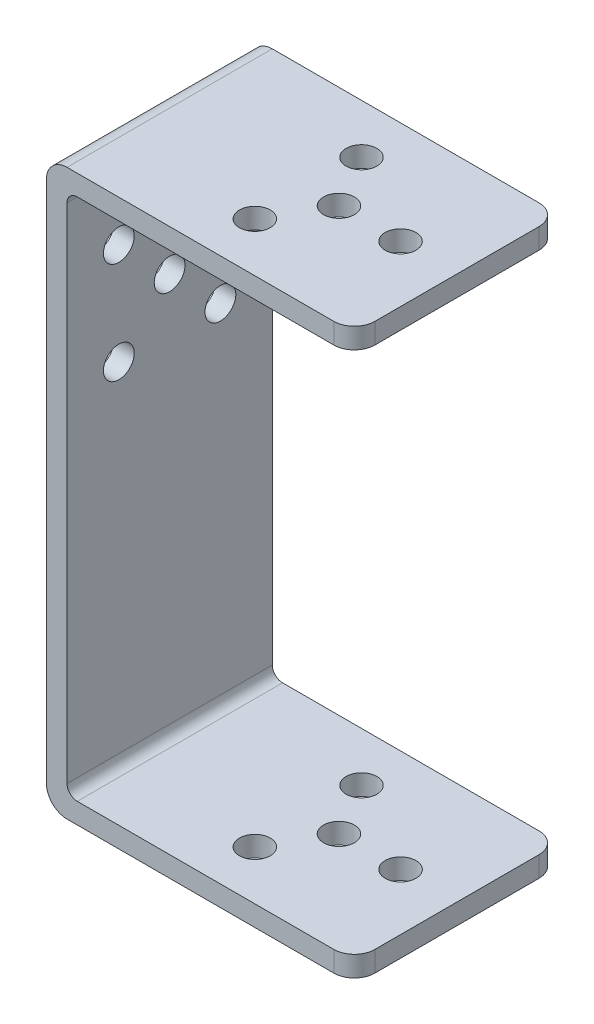
ISO-10303-21;
HEADER;
FILE_DESCRIPTION(('STEP AP214'),'2;1');
FILE_NAME('part.step','',(''),(''),'','','');
FILE_SCHEMA(('AUTOMOTIVE_DESIGN { 1 0 10303 214 1 1 1 1 }'));
ENDSEC;
DATA;
#1=APPLICATION_CONTEXT('core data for automotive mechanical design processes');
#2=APPLICATION_PROTOCOL_DEFINITION('international standard','automotive_design',2000,#1);
#3=PRODUCT_CONTEXT('',#1,'mechanical');
#4=PRODUCT('Part','Part','',(#3));
#5=PRODUCT_RELATED_PRODUCT_CATEGORY('part','',(#4));
#6=PRODUCT_DEFINITION_FORMATION('','',#4);
#7=PRODUCT_DEFINITION_CONTEXT('part definition',#1,'design');
#8=PRODUCT_DEFINITION('design','',#6,#7);
#9=PRODUCT_DEFINITION_SHAPE('','',#8);
#10=(LENGTH_UNIT() NAMED_UNIT(*) SI_UNIT(.MILLI.,.METRE.));
#11=(NAMED_UNIT(*) PLANE_ANGLE_UNIT() SI_UNIT($,.RADIAN.));
#12=(NAMED_UNIT(*) SI_UNIT($,.STERADIAN.) SOLID_ANGLE_UNIT());
#13=UNCERTAINTY_MEASURE_WITH_UNIT(LENGTH_MEASURE(1.E-05),#10,'distance_accuracy_value','');
#14=(GEOMETRIC_REPRESENTATION_CONTEXT(3) GLOBAL_UNCERTAINTY_ASSIGNED_CONTEXT((#13)) GLOBAL_UNIT_ASSIGNED_CONTEXT((#10,
#11,#12)) REPRESENTATION_CONTEXT('',''));
#15=CARTESIAN_POINT('',(0.,0.,0.));
#16=DIRECTION('',(0.,0.,1.));
#17=DIRECTION('',(1.,0.,0.));
#18=AXIS2_PLACEMENT_3D('',#15,#16,#17);
#19=CARTESIAN_POINT('',(0.,55.,20.));
#20=DIRECTION('',(1.,0.,0.));
#21=DIRECTION('',(0.,1.,0.));
#22=AXIS2_PLACEMENT_3D('',#19,#20,#21);
#23=PLANE('',#22);
#24=CARTESIAN_POINT('',(0.,36.0502525316942,5.05025253169428));
#25=DIRECTION('',(-1.,0.,0.));
#26=DIRECTION('',(0.,-1.,0.));
#27=AXIS2_PLACEMENT_3D('',#24,#25,#26);
#28=CIRCLE('',#27,1.5);
#29=CARTESIAN_POINT('',(0.,34.5502525316942,5.05025253169428));
#30=VERTEX_POINT('',#29);
#31=EDGE_CURVE('E475',#30,#30,#28,.T.);
#32=ORIENTED_EDGE('',*,*,#31,.F.);
#33=EDGE_LOOP('',(#32));
#34=FACE_BOUND('',#33,.T.);
#35=CARTESIAN_POINT('',(0.,36.0502525316943,14.9497474683059));
#36=DIRECTION('',(-1.,0.,0.));
#37=DIRECTION('',(0.,-1.,0.));
#38=AXIS2_PLACEMENT_3D('',#35,#36,#37);
#39=CIRCLE('',#38,1.5);
#40=CARTESIAN_POINT('',(0.,34.5502525316943,14.9497474683059));
#41=VERTEX_POINT('',#40);
#42=EDGE_CURVE('E391',#41,#41,#39,.T.);
#43=ORIENTED_EDGE('',*,*,#42,.F.);
#44=EDGE_LOOP('',(#43));
#45=FACE_BOUND('',#44,.T.);
#46=CARTESIAN_POINT('',(0.,45.949747468306,14.9497474683058));
#47=DIRECTION('',(-1.,0.,0.));
#48=DIRECTION('',(0.,-1.,0.));
#49=AXIS2_PLACEMENT_3D('',#46,#47,#48);
#50=CIRCLE('',#49,1.5);
#51=CARTESIAN_POINT('',(0.,44.449747468306,14.9497474683058));
#52=VERTEX_POINT('',#51);
#53=EDGE_CURVE('E461',#52,#52,#50,.T.);
#54=ORIENTED_EDGE('',*,*,#53,.F.);
#55=EDGE_LOOP('',(#54));
#56=FACE_BOUND('',#55,.T.);
#57=CARTESIAN_POINT('',(0.,45.9497474683058,5.05025253169416));
#58=DIRECTION('',(-1.,0.,0.));
#59=DIRECTION('',(0.,-1.,0.));
#60=AXIS2_PLACEMENT_3D('',#57,#58,#59);
#61=CIRCLE('',#60,1.5);
#62=CARTESIAN_POINT('',(0.,44.4497474683058,5.05025253169416));
#63=VERTEX_POINT('',#62);
#64=EDGE_CURVE('E464',#63,#63,#61,.T.);
#65=ORIENTED_EDGE('',*,*,#64,.F.);
#66=EDGE_LOOP('',(#65));
#67=FACE_BOUND('',#66,.T.);
#68=CARTESIAN_POINT('',(0.,41.,10.));
#69=DIRECTION('',(-1.,0.,0.));
#70=DIRECTION('',(0.,-1.,0.));
#71=AXIS2_PLACEMENT_3D('',#68,#69,#70);
#72=CIRCLE('',#71,1.5);
#73=CARTESIAN_POINT('',(0.,39.5,10.));
#74=VERTEX_POINT('',#73);
#75=EDGE_CURVE('E235',#74,#74,#72,.T.);
#76=ORIENTED_EDGE('',*,*,#75,.F.);
#77=EDGE_LOOP('',(#76));
#78=FACE_BOUND('',#77,.T.);
#79=DIRECTION('',(0.,-1.,0.));
#80=VECTOR('',#79,1.);
#81=CARTESIAN_POINT('',(0.,55.,0.));
#82=LINE('',#81,#80);
#83=CARTESIAN_POINT('',(0.,53.,0.));
#84=VERTEX_POINT('',#83);
#85=CARTESIAN_POINT('',(0.,2.,0.));
#86=VERTEX_POINT('',#85);
#87=EDGE_CURVE('E192',#84,#86,#82,.T.);
#88=ORIENTED_EDGE('',*,*,#87,.T.);
#89=DIRECTION('',(0.,0.,-1.));
#90=VECTOR('',#89,1.);
#91=CARTESIAN_POINT('',(0.,2.,20.));
#92=LINE('',#91,#90);
#93=CARTESIAN_POINT('',(0.,2.,20.));
#94=VERTEX_POINT('',#93);
#95=EDGE_CURVE('E166',#86,#94,#92,.F.);
#96=ORIENTED_EDGE('',*,*,#95,.T.);
#97=DIRECTION('',(0.,-1.,0.));
#98=VECTOR('',#97,1.);
#99=CARTESIAN_POINT('',(0.,55.,20.));
#100=LINE('',#99,#98);
#101=CARTESIAN_POINT('',(0.,53.,20.));
#102=VERTEX_POINT('',#101);
#103=EDGE_CURVE('E214',#102,#94,#100,.T.);
#104=ORIENTED_EDGE('',*,*,#103,.F.);
#105=DIRECTION('',(0.,0.,-1.));
#106=VECTOR('',#105,1.);
#107=CARTESIAN_POINT('',(0.,53.,20.));
#108=LINE('',#107,#106);
#109=EDGE_CURVE('E172',#102,#84,#108,.T.);
#110=ORIENTED_EDGE('',*,*,#109,.T.);
#111=EDGE_LOOP('',(#88,#96,#104,#110));
#112=FACE_BOUND('',#111,.T.);
#113=ADVANCED_FACE('F47',(#34,#45,#56,#67,#78,#112),#23,.F.);
#114=CARTESIAN_POINT('',(0.,0.,20.));
#115=DIRECTION('',(0.,1.,0.));
#116=DIRECTION('',(0.,0.,1.));
#117=AXIS2_PLACEMENT_3D('',#114,#115,#116);
#118=PLANE('',#117);
#119=CARTESIAN_POINT('',(15.5,0.,4.80384757729337));
#120=DIRECTION('',(0.,1.,0.));
#121=DIRECTION('',(-1.,0.,0.));
#122=AXIS2_PLACEMENT_3D('',#119,#120,#121);
#123=CIRCLE('',#122,1.5);
#124=CARTESIAN_POINT('',(14.,0.,4.80384757729337));
#125=VERTEX_POINT('',#124);
#126=EDGE_CURVE('E427',#125,#125,#123,.T.);
#127=ORIENTED_EDGE('',*,*,#126,.T.);
#128=EDGE_LOOP('',(#127));
#129=FACE_BOUND('',#128,.T.);
#130=CARTESIAN_POINT('',(15.5,0.,15.1961524227066));
#131=DIRECTION('',(0.,1.,0.));
#132=DIRECTION('',(-1.,0.,0.));
#133=AXIS2_PLACEMENT_3D('',#130,#131,#132);
#134=CIRCLE('',#133,1.5);
#135=CARTESIAN_POINT('',(14.,0.,15.1961524227066));
#136=VERTEX_POINT('',#135);
#137=EDGE_CURVE('E416',#136,#136,#134,.T.);
#138=ORIENTED_EDGE('',*,*,#137,.T.);
#139=EDGE_LOOP('',(#138));
#140=FACE_BOUND('',#139,.T.);
#141=CARTESIAN_POINT('',(24.5,0.,10.));
#142=DIRECTION('',(0.,1.,0.));
#143=DIRECTION('',(-1.,0.,0.));
#144=AXIS2_PLACEMENT_3D('',#141,#142,#143);
#145=CIRCLE('',#144,1.5);
#146=CARTESIAN_POINT('',(23.,0.,10.));
#147=VERTEX_POINT('',#146);
#148=EDGE_CURVE('E406',#147,#147,#145,.T.);
#149=ORIENTED_EDGE('',*,*,#148,.T.);
#150=EDGE_LOOP('',(#149));
#151=FACE_BOUND('',#150,.T.);
#152=CARTESIAN_POINT('',(18.5,0.,10.));
#153=DIRECTION('',(0.,1.,0.));
#154=DIRECTION('',(-1.,0.,0.));
#155=AXIS2_PLACEMENT_3D('',#152,#153,#154);
#156=CIRCLE('',#155,1.5);
#157=CARTESIAN_POINT('',(17.,0.,10.));
#158=VERTEX_POINT('',#157);
#159=EDGE_CURVE('E396',#158,#158,#156,.T.);
#160=ORIENTED_EDGE('',*,*,#159,.T.);
#161=EDGE_LOOP('',(#160));
#162=FACE_BOUND('',#161,.T.);
#163=DIRECTION('',(1.,0.,0.));
#164=VECTOR('',#163,1.);
#165=CARTESIAN_POINT('',(0.,0.,0.));
#166=LINE('',#165,#164);
#167=CARTESIAN_POINT('',(2.,0.,0.));
#168=VERTEX_POINT('',#167);
#169=CARTESIAN_POINT('',(28.,0.,0.));
#170=VERTEX_POINT('',#169);
#171=EDGE_CURVE('E179',#168,#170,#166,.T.);
#172=ORIENTED_EDGE('',*,*,#171,.T.);
#173=CARTESIAN_POINT('',(28.,0.,2.));
#174=DIRECTION('',(0.,1.,0.));
#175=DIRECTION('',(0.,0.,1.));
#176=AXIS2_PLACEMENT_3D('',#173,#174,#175);
#177=CIRCLE('',#176,2.);
#178=CARTESIAN_POINT('',(30.,0.,2.));
#179=VERTEX_POINT('',#178);
#180=EDGE_CURVE('E316',#170,#179,#177,.F.);
#181=ORIENTED_EDGE('',*,*,#180,.T.);
#182=DIRECTION('',(0.,0.,-1.));
#183=VECTOR('',#182,1.);
#184=CARTESIAN_POINT('',(30.,0.,20.));
#185=LINE('',#184,#183);
#186=CARTESIAN_POINT('',(30.,0.,18.));
#187=VERTEX_POINT('',#186);
#188=EDGE_CURVE('E184',#187,#179,#185,.T.);
#189=ORIENTED_EDGE('',*,*,#188,.F.);
#190=CARTESIAN_POINT('',(28.,0.,18.));
#191=DIRECTION('',(0.,1.,0.));
#192=DIRECTION('',(0.,0.,1.));
#193=AXIS2_PLACEMENT_3D('',#190,#191,#192);
#194=CIRCLE('',#193,2.);
#195=CARTESIAN_POINT('',(28.,0.,20.));
#196=VERTEX_POINT('',#195);
#197=EDGE_CURVE('E313',#187,#196,#194,.F.);
#198=ORIENTED_EDGE('',*,*,#197,.T.);
#199=DIRECTION('',(1.,0.,0.));
#200=VECTOR('',#199,1.);
#201=CARTESIAN_POINT('',(0.,0.,20.));
#202=LINE('',#201,#200);
#203=CARTESIAN_POINT('',(2.,0.,20.));
#204=VERTEX_POINT('',#203);
#205=EDGE_CURVE('E182',#204,#196,#202,.T.);
#206=ORIENTED_EDGE('',*,*,#205,.F.);
#207=DIRECTION('',(0.,0.,-1.));
#208=VECTOR('',#207,1.);
#209=CARTESIAN_POINT('',(2.,0.,20.));
#210=LINE('',#209,#208);
#211=EDGE_CURVE('E165',#204,#168,#210,.T.);
#212=ORIENTED_EDGE('',*,*,#211,.T.);
#213=EDGE_LOOP('',(#172,#181,#189,#198,#206,#212));
#214=FACE_BOUND('',#213,.T.);
#215=ADVANCED_FACE('F178',(#129,#140,#151,#162,#214),#118,.F.);
#216=CARTESIAN_POINT('',(30.,0.,20.));
#217=DIRECTION('',(-1.,0.,0.));
#218=DIRECTION('',(0.,0.,1.));
#219=AXIS2_PLACEMENT_3D('',#216,#217,#218);
#220=PLANE('',#219);
#221=ORIENTED_EDGE('',*,*,#188,.T.);
#222=DIRECTION('',(0.,1.,0.));
#223=VECTOR('',#222,1.);
#224=CARTESIAN_POINT('',(30.,0.,2.));
#225=LINE('',#224,#223);
#226=CARTESIAN_POINT('',(30.,2.,2.));
#227=VERTEX_POINT('',#226);
#228=EDGE_CURVE('E298',#179,#227,#225,.T.);
#229=ORIENTED_EDGE('',*,*,#228,.T.);
#230=DIRECTION('',(0.,0.,-1.));
#231=VECTOR('',#230,1.);
#232=CARTESIAN_POINT('',(30.,2.,20.));
#233=LINE('',#232,#231);
#234=CARTESIAN_POINT('',(30.,2.,18.));
#235=VERTEX_POINT('',#234);
#236=EDGE_CURVE('E223',#235,#227,#233,.T.);
#237=ORIENTED_EDGE('',*,*,#236,.F.);
#238=DIRECTION('',(0.,1.,0.));
#239=VECTOR('',#238,1.);
#240=CARTESIAN_POINT('',(30.,0.,18.));
#241=LINE('',#240,#239);
#242=EDGE_CURVE('E295',#235,#187,#241,.F.);
#243=ORIENTED_EDGE('',*,*,#242,.T.);
#244=EDGE_LOOP('',(#221,#229,#237,#243));
#245=FACE_BOUND('',#244,.T.);
#246=ADVANCED_FACE('F787',(#245),#220,.F.);
#247=CARTESIAN_POINT('',(30.,2.,20.));
#248=DIRECTION('',(0.,-1.,0.));
#249=DIRECTION('',(1.,0.,0.));
#250=AXIS2_PLACEMENT_3D('',#247,#248,#249);
#251=PLANE('',#250);
#252=CARTESIAN_POINT('',(15.5,2.,4.80384757729337));
#253=DIRECTION('',(0.,-1.,0.));
#254=DIRECTION('',(1.,0.,0.));
#255=AXIS2_PLACEMENT_3D('',#252,#253,#254);
#256=CIRCLE('',#255,1.5);
#257=CARTESIAN_POINT('',(17.,2.,4.80384757729337));
#258=VERTEX_POINT('',#257);
#259=EDGE_CURVE('E479',#258,#258,#256,.T.);
#260=ORIENTED_EDGE('',*,*,#259,.T.);
#261=EDGE_LOOP('',(#260));
#262=FACE_BOUND('',#261,.T.);
#263=CARTESIAN_POINT('',(15.5,2.,15.1961524227066));
#264=DIRECTION('',(0.,-1.,0.));
#265=DIRECTION('',(1.,0.,0.));
#266=AXIS2_PLACEMENT_3D('',#263,#264,#265);
#267=CIRCLE('',#266,1.5);
#268=CARTESIAN_POINT('',(17.,2.,15.1961524227066));
#269=VERTEX_POINT('',#268);
#270=EDGE_CURVE('E481',#269,#269,#267,.T.);
#271=ORIENTED_EDGE('',*,*,#270,.T.);
#272=EDGE_LOOP('',(#271));
#273=FACE_BOUND('',#272,.T.);
#274=CARTESIAN_POINT('',(24.5,2.,10.));
#275=DIRECTION('',(0.,-1.,0.));
#276=DIRECTION('',(1.,0.,0.));
#277=AXIS2_PLACEMENT_3D('',#274,#275,#276);
#278=CIRCLE('',#277,1.5);
#279=CARTESIAN_POINT('',(26.,2.,10.));
#280=VERTEX_POINT('',#279);
#281=EDGE_CURVE('E441',#280,#280,#278,.T.);
#282=ORIENTED_EDGE('',*,*,#281,.T.);
#283=EDGE_LOOP('',(#282));
#284=FACE_BOUND('',#283,.T.);
#285=CARTESIAN_POINT('',(18.5,2.,10.));
#286=DIRECTION('',(0.,-1.,0.));
#287=DIRECTION('',(1.,0.,0.));
#288=AXIS2_PLACEMENT_3D('',#285,#286,#287);
#289=CIRCLE('',#288,1.5);
#290=CARTESIAN_POINT('',(20.,2.,10.));
#291=VERTEX_POINT('',#290);
#292=EDGE_CURVE('E442',#291,#291,#289,.T.);
#293=ORIENTED_EDGE('',*,*,#292,.T.);
#294=EDGE_LOOP('',(#293));
#295=FACE_BOUND('',#294,.T.);
#296=ORIENTED_EDGE('',*,*,#236,.T.);
#297=CARTESIAN_POINT('',(28.,2.,2.));
#298=DIRECTION('',(0.,-1.,0.));
#299=DIRECTION('',(1.,0.,0.));
#300=AXIS2_PLACEMENT_3D('',#297,#298,#299);
#301=CIRCLE('',#300,2.);
#302=CARTESIAN_POINT('',(28.,2.,0.));
#303=VERTEX_POINT('',#302);
#304=EDGE_CURVE('E305',#227,#303,#301,.F.);
#305=ORIENTED_EDGE('',*,*,#304,.T.);
#306=DIRECTION('',(-1.,0.,0.));
#307=VECTOR('',#306,1.);
#308=CARTESIAN_POINT('',(30.,2.,0.));
#309=LINE('',#308,#307);
#310=CARTESIAN_POINT('',(3.00000000000001,2.,0.));
#311=VERTEX_POINT('',#310);
#312=EDGE_CURVE('E191',#303,#311,#309,.T.);
#313=ORIENTED_EDGE('',*,*,#312,.T.);
#314=DIRECTION('',(0.,0.,-1.));
#315=VECTOR('',#314,1.);
#316=CARTESIAN_POINT('',(3.00000000000001,2.,20.));
#317=LINE('',#316,#315);
#318=CARTESIAN_POINT('',(3.00000000000001,2.,20.));
#319=VERTEX_POINT('',#318);
#320=EDGE_CURVE('E278',#311,#319,#317,.F.);
#321=ORIENTED_EDGE('',*,*,#320,.T.);
#322=DIRECTION('',(-1.,0.,0.));
#323=VECTOR('',#322,1.);
#324=CARTESIAN_POINT('',(30.,2.,20.));
#325=LINE('',#324,#323);
#326=CARTESIAN_POINT('',(28.,2.,20.));
#327=VERTEX_POINT('',#326);
#328=EDGE_CURVE('E378',#327,#319,#325,.T.);
#329=ORIENTED_EDGE('',*,*,#328,.F.);
#330=CARTESIAN_POINT('',(28.,2.,18.));
#331=DIRECTION('',(0.,-1.,0.));
#332=DIRECTION('',(1.,0.,0.));
#333=AXIS2_PLACEMENT_3D('',#330,#331,#332);
#334=CIRCLE('',#333,2.);
#335=EDGE_CURVE('E302',#327,#235,#334,.F.);
#336=ORIENTED_EDGE('',*,*,#335,.T.);
#337=EDGE_LOOP('',(#296,#305,#313,#321,#329,#336));
#338=FACE_BOUND('',#337,.T.);
#339=ADVANCED_FACE('F564',(#262,#273,#284,#295,#338),#251,.F.);
#340=CARTESIAN_POINT('',(2.00000000000001,2.,20.));
#341=DIRECTION('',(-1.,0.,0.));
#342=DIRECTION('',(0.,-1.,0.));
#343=AXIS2_PLACEMENT_3D('',#340,#341,#342);
#344=PLANE('',#343);
#345=CARTESIAN_POINT('',(2.00000000000001,36.0502525316942,5.05025253169428));
#346=DIRECTION('',(-1.,0.,0.));
#347=DIRECTION('',(0.,-1.,0.));
#348=AXIS2_PLACEMENT_3D('',#345,#346,#347);
#349=CIRCLE('',#348,1.5);
#350=CARTESIAN_POINT('',(2.00000000000001,34.5502525316942,5.05025253169428));
#351=VERTEX_POINT('',#350);
#352=EDGE_CURVE('E201',#351,#351,#349,.T.);
#353=ORIENTED_EDGE('',*,*,#352,.T.);
#354=EDGE_LOOP('',(#353));
#355=FACE_BOUND('',#354,.T.);
#356=CARTESIAN_POINT('',(2.00000000000001,36.0502525316943,14.9497474683059));
#357=DIRECTION('',(-1.,0.,0.));
#358=DIRECTION('',(0.,-1.,0.));
#359=AXIS2_PLACEMENT_3D('',#356,#357,#358);
#360=CIRCLE('',#359,1.5);
#361=CARTESIAN_POINT('',(2.00000000000001,34.5502525316943,14.9497474683059));
#362=VERTEX_POINT('',#361);
#363=EDGE_CURVE('E243',#362,#362,#360,.T.);
#364=ORIENTED_EDGE('',*,*,#363,.T.);
#365=EDGE_LOOP('',(#364));
#366=FACE_BOUND('',#365,.T.);
#367=CARTESIAN_POINT('',(2.00000000000001,45.949747468306,14.9497474683058));
#368=DIRECTION('',(-1.,0.,0.));
#369=DIRECTION('',(0.,-1.,0.));
#370=AXIS2_PLACEMENT_3D('',#367,#368,#369);
#371=CIRCLE('',#370,1.5);
#372=CARTESIAN_POINT('',(2.00000000000001,44.449747468306,14.9497474683058));
#373=VERTEX_POINT('',#372);
#374=EDGE_CURVE('E239',#373,#373,#371,.T.);
#375=ORIENTED_EDGE('',*,*,#374,.T.);
#376=EDGE_LOOP('',(#375));
#377=FACE_BOUND('',#376,.T.);
#378=CARTESIAN_POINT('',(2.00000000000001,45.9497474683058,5.05025253169416));
#379=DIRECTION('',(-1.,0.,0.));
#380=DIRECTION('',(0.,-1.,0.));
#381=AXIS2_PLACEMENT_3D('',#378,#379,#380);
#382=CIRCLE('',#381,1.5);
#383=CARTESIAN_POINT('',(2.00000000000001,44.4497474683058,5.05025253169416));
#384=VERTEX_POINT('',#383);
#385=EDGE_CURVE('E234',#384,#384,#382,.T.);
#386=ORIENTED_EDGE('',*,*,#385,.T.);
#387=EDGE_LOOP('',(#386));
#388=FACE_BOUND('',#387,.T.);
#389=CARTESIAN_POINT('',(2.00000000000001,41.,10.));
#390=DIRECTION('',(-1.,0.,0.));
#391=DIRECTION('',(0.,-1.,0.));
#392=AXIS2_PLACEMENT_3D('',#389,#390,#391);
#393=CIRCLE('',#392,1.5);
#394=CARTESIAN_POINT('',(2.00000000000001,39.5,10.));
#395=VERTEX_POINT('',#394);
#396=EDGE_CURVE('E230',#395,#395,#393,.T.);
#397=ORIENTED_EDGE('',*,*,#396,.T.);
#398=EDGE_LOOP('',(#397));
#399=FACE_BOUND('',#398,.T.);
#400=DIRECTION('',(0.,1.,0.));
#401=VECTOR('',#400,1.);
#402=CARTESIAN_POINT('',(2.00000000000001,2.,0.));
#403=LINE('',#402,#401);
#404=CARTESIAN_POINT('',(2.00000000000001,3.,0.));
#405=VERTEX_POINT('',#404);
#406=CARTESIAN_POINT('',(2.00000000000001,52.,0.));
#407=VERTEX_POINT('',#406);
#408=EDGE_CURVE('E198',#405,#407,#403,.T.);
#409=ORIENTED_EDGE('',*,*,#408,.T.);
#410=DIRECTION('',(0.,0.,-1.));
#411=VECTOR('',#410,1.);
#412=CARTESIAN_POINT('',(2.00000000000001,52.,20.));
#413=LINE('',#412,#411);
#414=CARTESIAN_POINT('',(2.00000000000001,52.,20.));
#415=VERTEX_POINT('',#414);
#416=EDGE_CURVE('E275',#407,#415,#413,.F.);
#417=ORIENTED_EDGE('',*,*,#416,.T.);
#418=DIRECTION('',(0.,1.,0.));
#419=VECTOR('',#418,1.);
#420=CARTESIAN_POINT('',(2.00000000000001,2.,20.));
#421=LINE('',#420,#419);
#422=CARTESIAN_POINT('',(2.00000000000001,3.,20.));
#423=VERTEX_POINT('',#422);
#424=EDGE_CURVE('E355',#423,#415,#421,.T.);
#425=ORIENTED_EDGE('',*,*,#424,.F.);
#426=DIRECTION('',(0.,0.,-1.));
#427=VECTOR('',#426,1.);
#428=CARTESIAN_POINT('',(2.00000000000001,3.,0.));
#429=LINE('',#428,#427);
#430=EDGE_CURVE('E271',#423,#405,#429,.T.);
#431=ORIENTED_EDGE('',*,*,#430,.T.);
#432=EDGE_LOOP('',(#409,#417,#425,#431));
#433=FACE_BOUND('',#432,.T.);
#434=ADVANCED_FACE('F561',(#355,#366,#377,#388,#399,#433),#344,.F.);
#435=CARTESIAN_POINT('',(2.00000000000001,53.,20.));
#436=DIRECTION('',(0.,1.,0.));
#437=DIRECTION('',(0.,0.,1.));
#438=AXIS2_PLACEMENT_3D('',#435,#436,#437);
#439=PLANE('',#438);
#440=CARTESIAN_POINT('',(15.5,53.,4.80384757729337));
#441=DIRECTION('',(0.,1.,0.));
#442=DIRECTION('',(0.,0.,1.));
#443=AXIS2_PLACEMENT_3D('',#440,#441,#442);
#444=CIRCLE('',#443,1.5);
#445=CARTESIAN_POINT('',(15.5,53.,6.30384757729337));
#446=VERTEX_POINT('',#445);
#447=EDGE_CURVE('E485',#446,#446,#444,.T.);
#448=ORIENTED_EDGE('',*,*,#447,.T.);
#449=EDGE_LOOP('',(#448));
#450=FACE_BOUND('',#449,.T.);
#451=CARTESIAN_POINT('',(15.5,53.,15.1961524227066));
#452=DIRECTION('',(0.,1.,0.));
#453=DIRECTION('',(0.,0.,1.));
#454=AXIS2_PLACEMENT_3D('',#451,#452,#453);
#455=CIRCLE('',#454,1.5);
#456=CARTESIAN_POINT('',(15.5,53.,16.6961524227066));
#457=VERTEX_POINT('',#456);
#458=EDGE_CURVE('E486',#457,#457,#455,.T.);
#459=ORIENTED_EDGE('',*,*,#458,.T.);
#460=EDGE_LOOP('',(#459));
#461=FACE_BOUND('',#460,.T.);
#462=CARTESIAN_POINT('',(24.5,53.,10.));
#463=DIRECTION('',(0.,1.,0.));
#464=DIRECTION('',(0.,0.,1.));
#465=AXIS2_PLACEMENT_3D('',#462,#463,#464);
#466=CIRCLE('',#465,1.5);
#467=CARTESIAN_POINT('',(24.5,53.,11.5));
#468=VERTEX_POINT('',#467);
#469=EDGE_CURVE('E437',#468,#468,#466,.T.);
#470=ORIENTED_EDGE('',*,*,#469,.T.);
#471=EDGE_LOOP('',(#470));
#472=FACE_BOUND('',#471,.T.);
#473=CARTESIAN_POINT('',(18.5,53.,10.));
#474=DIRECTION('',(0.,1.,0.));
#475=DIRECTION('',(0.,0.,1.));
#476=AXIS2_PLACEMENT_3D('',#473,#474,#475);
#477=CIRCLE('',#476,1.5);
#478=CARTESIAN_POINT('',(18.5,53.,11.5));
#479=VERTEX_POINT('',#478);
#480=EDGE_CURVE('E447',#479,#479,#477,.T.);
#481=ORIENTED_EDGE('',*,*,#480,.T.);
#482=EDGE_LOOP('',(#481));
#483=FACE_BOUND('',#482,.T.);
#484=DIRECTION('',(1.,0.,0.));
#485=VECTOR('',#484,1.);
#486=CARTESIAN_POINT('',(2.00000000000001,53.,0.));
#487=LINE('',#486,#485);
#488=CARTESIAN_POINT('',(3.00000000000001,53.,0.));
#489=VERTEX_POINT('',#488);
#490=CARTESIAN_POINT('',(28.,53.,0.));
#491=VERTEX_POINT('',#490);
#492=EDGE_CURVE('E208',#489,#491,#487,.T.);
#493=ORIENTED_EDGE('',*,*,#492,.T.);
#494=CARTESIAN_POINT('',(28.,53.,2.));
#495=DIRECTION('',(0.,1.,0.));
#496=DIRECTION('',(0.,0.,1.));
#497=AXIS2_PLACEMENT_3D('',#494,#495,#496);
#498=CIRCLE('',#497,2.);
#499=CARTESIAN_POINT('',(30.,53.,2.));
#500=VERTEX_POINT('',#499);
#501=EDGE_CURVE('E11',#491,#500,#498,.F.);
#502=ORIENTED_EDGE('',*,*,#501,.T.);
#503=DIRECTION('',(0.,0.,-1.));
#504=VECTOR('',#503,1.);
#505=CARTESIAN_POINT('',(30.,53.,20.));
#506=LINE('',#505,#504);
#507=CARTESIAN_POINT('',(30.,53.,18.));
#508=VERTEX_POINT('',#507);
#509=EDGE_CURVE('E219',#508,#500,#506,.T.);
#510=ORIENTED_EDGE('',*,*,#509,.F.);
#511=CARTESIAN_POINT('',(28.,53.,18.));
#512=DIRECTION('',(0.,1.,0.));
#513=DIRECTION('',(0.,0.,1.));
#514=AXIS2_PLACEMENT_3D('',#511,#512,#513);
#515=CIRCLE('',#514,2.);
#516=CARTESIAN_POINT('',(28.,53.,20.));
#517=VERTEX_POINT('',#516);
#518=EDGE_CURVE('E56',#508,#517,#515,.F.);
#519=ORIENTED_EDGE('',*,*,#518,.T.);
#520=DIRECTION('',(1.,0.,0.));
#521=VECTOR('',#520,1.);
#522=CARTESIAN_POINT('',(2.00000000000001,53.,20.));
#523=LINE('',#522,#521);
#524=CARTESIAN_POINT('',(3.00000000000001,53.,20.));
#525=VERTEX_POINT('',#524);
#526=EDGE_CURVE('E345',#525,#517,#523,.T.);
#527=ORIENTED_EDGE('',*,*,#526,.F.);
#528=DIRECTION('',(0.,0.,-1.));
#529=VECTOR('',#528,1.);
#530=CARTESIAN_POINT('',(3.00000000000001,53.,0.));
#531=LINE('',#530,#529);
#532=EDGE_CURVE('E267',#525,#489,#531,.T.);
#533=ORIENTED_EDGE('',*,*,#532,.T.);
#534=EDGE_LOOP('',(#493,#502,#510,#519,#527,#533));
#535=FACE_BOUND('',#534,.T.);
#536=ADVANCED_FACE('F344',(#450,#461,#472,#483,#535),#439,.F.);
#537=CARTESIAN_POINT('',(30.,53.,20.));
#538=DIRECTION('',(-1.,0.,0.));
#539=DIRECTION('',(0.,0.,1.));
#540=AXIS2_PLACEMENT_3D('',#537,#538,#539);
#541=PLANE('',#540);
#542=ORIENTED_EDGE('',*,*,#509,.T.);
#543=DIRECTION('',(0.,1.,0.));
#544=VECTOR('',#543,1.);
#545=CARTESIAN_POINT('',(30.,53.,2.));
#546=LINE('',#545,#544);
#547=CARTESIAN_POINT('',(30.,55.,2.));
#548=VERTEX_POINT('',#547);
#549=EDGE_CURVE('E329',#500,#548,#546,.T.);
#550=ORIENTED_EDGE('',*,*,#549,.T.);
#551=DIRECTION('',(0.,0.,-1.));
#552=VECTOR('',#551,1.);
#553=CARTESIAN_POINT('',(30.,55.,20.));
#554=LINE('',#553,#552);
#555=CARTESIAN_POINT('',(30.,55.,18.));
#556=VERTEX_POINT('',#555);
#557=EDGE_CURVE('E215',#556,#548,#554,.T.);
#558=ORIENTED_EDGE('',*,*,#557,.F.);
#559=DIRECTION('',(0.,1.,0.));
#560=VECTOR('',#559,1.);
#561=CARTESIAN_POINT('',(30.,53.,18.));
#562=LINE('',#561,#560);
#563=EDGE_CURVE('E68',#556,#508,#562,.F.);
#564=ORIENTED_EDGE('',*,*,#563,.T.);
#565=EDGE_LOOP('',(#542,#550,#558,#564));
#566=FACE_BOUND('',#565,.T.);
#567=ADVANCED_FACE('F359',(#566),#541,.F.);
#568=CARTESIAN_POINT('',(30.,55.,20.));
#569=DIRECTION('',(0.,-1.,0.));
#570=DIRECTION('',(1.,0.,0.));
#571=AXIS2_PLACEMENT_3D('',#568,#569,#570);
#572=PLANE('',#571);
#573=CARTESIAN_POINT('',(15.5,55.,4.80384757729337));
#574=DIRECTION('',(0.,1.,0.));
#575=DIRECTION('',(-1.,0.,0.));
#576=AXIS2_PLACEMENT_3D('',#573,#574,#575);
#577=CIRCLE('',#576,1.5);
#578=CARTESIAN_POINT('',(14.,55.,4.80384757729337));
#579=VERTEX_POINT('',#578);
#580=EDGE_CURVE('E421',#579,#579,#577,.T.);
#581=ORIENTED_EDGE('',*,*,#580,.F.);
#582=EDGE_LOOP('',(#581));
#583=FACE_BOUND('',#582,.T.);
#584=CARTESIAN_POINT('',(15.5,55.,15.1961524227066));
#585=DIRECTION('',(0.,1.,0.));
#586=DIRECTION('',(-1.,0.,0.));
#587=AXIS2_PLACEMENT_3D('',#584,#585,#586);
#588=CIRCLE('',#587,1.5);
#589=CARTESIAN_POINT('',(14.,55.,15.1961524227066));
#590=VERTEX_POINT('',#589);
#591=EDGE_CURVE('E411',#590,#590,#588,.T.);
#592=ORIENTED_EDGE('',*,*,#591,.F.);
#593=EDGE_LOOP('',(#592));
#594=FACE_BOUND('',#593,.T.);
#595=CARTESIAN_POINT('',(24.5,55.,10.));
#596=DIRECTION('',(0.,1.,0.));
#597=DIRECTION('',(-1.,0.,0.));
#598=AXIS2_PLACEMENT_3D('',#595,#596,#597);
#599=CIRCLE('',#598,1.5);
#600=CARTESIAN_POINT('',(23.,55.,10.));
#601=VERTEX_POINT('',#600);
#602=EDGE_CURVE('E397',#601,#601,#599,.T.);
#603=ORIENTED_EDGE('',*,*,#602,.F.);
#604=EDGE_LOOP('',(#603));
#605=FACE_BOUND('',#604,.T.);
#606=CARTESIAN_POINT('',(18.5,55.,10.));
#607=DIRECTION('',(0.,1.,0.));
#608=DIRECTION('',(-1.,0.,0.));
#609=AXIS2_PLACEMENT_3D('',#606,#607,#608);
#610=CIRCLE('',#609,1.5);
#611=CARTESIAN_POINT('',(17.,55.,10.));
#612=VERTEX_POINT('',#611);
#613=EDGE_CURVE('E393',#612,#612,#610,.T.);
#614=ORIENTED_EDGE('',*,*,#613,.F.);
#615=EDGE_LOOP('',(#614));
#616=FACE_BOUND('',#615,.T.);
#617=ORIENTED_EDGE('',*,*,#557,.T.);
#618=CARTESIAN_POINT('',(28.,55.,2.));
#619=DIRECTION('',(0.,-1.,0.));
#620=DIRECTION('',(1.,0.,0.));
#621=AXIS2_PLACEMENT_3D('',#618,#619,#620);
#622=CIRCLE('',#621,2.);
#623=CARTESIAN_POINT('',(28.,55.,0.));
#624=VERTEX_POINT('',#623);
#625=EDGE_CURVE('E336',#548,#624,#622,.F.);
#626=ORIENTED_EDGE('',*,*,#625,.T.);
#627=DIRECTION('',(-1.,0.,0.));
#628=VECTOR('',#627,1.);
#629=CARTESIAN_POINT('',(30.,55.,0.));
#630=LINE('',#629,#628);
#631=CARTESIAN_POINT('',(2.,55.,0.));
#632=VERTEX_POINT('',#631);
#633=EDGE_CURVE('E211',#624,#632,#630,.T.);
#634=ORIENTED_EDGE('',*,*,#633,.T.);
#635=DIRECTION('',(0.,0.,-1.));
#636=VECTOR('',#635,1.);
#637=CARTESIAN_POINT('',(2.,55.,20.));
#638=LINE('',#637,#636);
#639=CARTESIAN_POINT('',(2.,55.,20.));
#640=VERTEX_POINT('',#639);
#641=EDGE_CURVE('E263',#632,#640,#638,.F.);
#642=ORIENTED_EDGE('',*,*,#641,.T.);
#643=DIRECTION('',(-1.,0.,0.));
#644=VECTOR('',#643,1.);
#645=CARTESIAN_POINT('',(30.,55.,20.));
#646=LINE('',#645,#644);
#647=CARTESIAN_POINT('',(28.,55.,20.));
#648=VERTEX_POINT('',#647);
#649=EDGE_CURVE('E220',#648,#640,#646,.T.);
#650=ORIENTED_EDGE('',*,*,#649,.F.);
#651=CARTESIAN_POINT('',(28.,55.,18.));
#652=DIRECTION('',(0.,-1.,0.));
#653=DIRECTION('',(1.,0.,0.));
#654=AXIS2_PLACEMENT_3D('',#651,#652,#653);
#655=CIRCLE('',#654,2.);
#656=EDGE_CURVE('E333',#648,#556,#655,.F.);
#657=ORIENTED_EDGE('',*,*,#656,.T.);
#658=EDGE_LOOP('',(#617,#626,#634,#642,#650,#657));
#659=FACE_BOUND('',#658,.T.);
#660=ADVANCED_FACE('F358',(#583,#594,#605,#616,#659),#572,.F.);
#661=CARTESIAN_POINT('',(0.,0.,20.));
#662=DIRECTION('',(0.,0.,1.));
#663=DIRECTION('',(1.,0.,0.));
#664=AXIS2_PLACEMENT_3D('',#661,#662,#663);
#665=PLANE('',#664);
#666=ORIENTED_EDGE('',*,*,#205,.T.);
#667=DIRECTION('',(0.,1.,0.));
#668=VECTOR('',#667,1.);
#669=CARTESIAN_POINT('',(28.,2.,20.));
#670=LINE('',#669,#668);
#671=EDGE_CURVE('E323',#196,#327,#670,.T.);
#672=ORIENTED_EDGE('',*,*,#671,.T.);
#673=ORIENTED_EDGE('',*,*,#328,.T.);
#674=CARTESIAN_POINT('',(3.00000000000001,3.,20.));
#675=DIRECTION('',(0.,0.,1.));
#676=DIRECTION('',(1.,0.,0.));
#677=AXIS2_PLACEMENT_3D('',#674,#675,#676);
#678=CIRCLE('',#677,1.);
#679=EDGE_CURVE('E292',#319,#423,#678,.F.);
#680=ORIENTED_EDGE('',*,*,#679,.T.);
#681=ORIENTED_EDGE('',*,*,#424,.T.);
#682=CARTESIAN_POINT('',(3.00000000000001,52.,20.));
#683=DIRECTION('',(0.,0.,1.));
#684=DIRECTION('',(1.,0.,0.));
#685=AXIS2_PLACEMENT_3D('',#682,#683,#684);
#686=CIRCLE('',#685,1.);
#687=EDGE_CURVE('E285',#415,#525,#686,.F.);
#688=ORIENTED_EDGE('',*,*,#687,.T.);
#689=ORIENTED_EDGE('',*,*,#526,.T.);
#690=DIRECTION('',(0.,1.,0.));
#691=VECTOR('',#690,1.);
#692=CARTESIAN_POINT('',(28.,55.,20.));
#693=LINE('',#692,#691);
#694=EDGE_CURVE('E319',#517,#648,#693,.T.);
#695=ORIENTED_EDGE('',*,*,#694,.T.);
#696=ORIENTED_EDGE('',*,*,#649,.T.);
#697=CARTESIAN_POINT('',(2.,53.,20.));
#698=DIRECTION('',(0.,0.,1.));
#699=DIRECTION('',(1.,0.,0.));
#700=AXIS2_PLACEMENT_3D('',#697,#698,#699);
#701=CIRCLE('',#700,2.);
#702=EDGE_CURVE('E257',#640,#102,#701,.T.);
#703=ORIENTED_EDGE('',*,*,#702,.T.);
#704=ORIENTED_EDGE('',*,*,#103,.T.);
#705=CARTESIAN_POINT('',(2.,2.,20.));
#706=DIRECTION('',(0.,0.,1.));
#707=DIRECTION('',(1.,0.,0.));
#708=AXIS2_PLACEMENT_3D('',#705,#706,#707);
#709=CIRCLE('',#708,2.);
#710=EDGE_CURVE('E260',#94,#204,#709,.T.);
#711=ORIENTED_EDGE('',*,*,#710,.T.);
#712=EDGE_LOOP('',(#666,#672,#673,#680,#681,#688,#689,#695,#696,#703,#704,#711));
#713=FACE_BOUND('',#712,.T.);
#714=ADVANCED_FACE('F350',(#713),#665,.T.);
#715=CARTESIAN_POINT('',(0.,0.,0.));
#716=DIRECTION('',(0.,0.,1.));
#717=DIRECTION('',(1.,0.,0.));
#718=AXIS2_PLACEMENT_3D('',#715,#716,#717);
#719=PLANE('',#718);
#720=ORIENTED_EDGE('',*,*,#312,.F.);
#721=DIRECTION('',(0.,1.,0.));
#722=VECTOR('',#721,1.);
#723=CARTESIAN_POINT('',(28.,0.,0.));
#724=LINE('',#723,#722);
#725=EDGE_CURVE('E189',#303,#170,#724,.F.);
#726=ORIENTED_EDGE('',*,*,#725,.T.);
#727=ORIENTED_EDGE('',*,*,#171,.F.);
#728=CARTESIAN_POINT('',(2.,2.,0.));
#729=DIRECTION('',(0.,0.,1.));
#730=DIRECTION('',(1.,0.,0.));
#731=AXIS2_PLACEMENT_3D('',#728,#729,#730);
#732=CIRCLE('',#731,2.);
#733=EDGE_CURVE('E161',#168,#86,#732,.F.);
#734=ORIENTED_EDGE('',*,*,#733,.T.);
#735=ORIENTED_EDGE('',*,*,#87,.F.);
#736=CARTESIAN_POINT('',(2.,53.,0.));
#737=DIRECTION('',(0.,0.,1.));
#738=DIRECTION('',(1.,0.,0.));
#739=AXIS2_PLACEMENT_3D('',#736,#737,#738);
#740=CIRCLE('',#739,2.);
#741=EDGE_CURVE('E173',#84,#632,#740,.F.);
#742=ORIENTED_EDGE('',*,*,#741,.T.);
#743=ORIENTED_EDGE('',*,*,#633,.F.);
#744=DIRECTION('',(0.,1.,0.));
#745=VECTOR('',#744,1.);
#746=CARTESIAN_POINT('',(28.,0.,0.));
#747=LINE('',#746,#745);
#748=EDGE_CURVE('E308',#624,#491,#747,.F.);
#749=ORIENTED_EDGE('',*,*,#748,.T.);
#750=ORIENTED_EDGE('',*,*,#492,.F.);
#751=CARTESIAN_POINT('',(3.00000000000001,52.,0.));
#752=DIRECTION('',(0.,0.,1.));
#753=DIRECTION('',(1.,0.,0.));
#754=AXIS2_PLACEMENT_3D('',#751,#752,#753);
#755=CIRCLE('',#754,1.);
#756=EDGE_CURVE('E282',#489,#407,#755,.T.);
#757=ORIENTED_EDGE('',*,*,#756,.T.);
#758=ORIENTED_EDGE('',*,*,#408,.F.);
#759=CARTESIAN_POINT('',(3.00000000000001,3.,0.));
#760=DIRECTION('',(0.,0.,1.));
#761=DIRECTION('',(1.,0.,0.));
#762=AXIS2_PLACEMENT_3D('',#759,#760,#761);
#763=CIRCLE('',#762,1.);
#764=EDGE_CURVE('E288',#405,#311,#763,.T.);
#765=ORIENTED_EDGE('',*,*,#764,.T.);
#766=EDGE_LOOP('',(#720,#726,#727,#734,#735,#742,#743,#749,#750,#757,#758,#765));
#767=FACE_BOUND('',#766,.T.);
#768=ADVANCED_FACE('F187',(#767),#719,.F.);
#769=CARTESIAN_POINT('',(10.,41.,10.));
#770=DIRECTION('',(-1.,0.,0.));
#771=DIRECTION('',(0.,-1.,0.));
#772=AXIS2_PLACEMENT_3D('',#769,#770,#771);
#773=CYLINDRICAL_SURFACE('',#772,1.5);
#774=ORIENTED_EDGE('',*,*,#75,.T.);
#775=EDGE_LOOP('',(#774));
#776=FACE_BOUND('',#775,.T.);
#777=ORIENTED_EDGE('',*,*,#396,.F.);
#778=EDGE_LOOP('',(#777));
#779=FACE_BOUND('',#778,.T.);
#780=ADVANCED_FACE('F554',(#776,#779),#773,.F.);
#781=CARTESIAN_POINT('',(10.,45.9497474683058,5.05025253169416));
#782=DIRECTION('',(-1.,0.,0.));
#783=DIRECTION('',(0.,-1.,0.));
#784=AXIS2_PLACEMENT_3D('',#781,#782,#783);
#785=CYLINDRICAL_SURFACE('',#784,1.5);
#786=ORIENTED_EDGE('',*,*,#64,.T.);
#787=EDGE_LOOP('',(#786));
#788=FACE_BOUND('',#787,.T.);
#789=ORIENTED_EDGE('',*,*,#385,.F.);
#790=EDGE_LOOP('',(#789));
#791=FACE_BOUND('',#790,.T.);
#792=ADVANCED_FACE('F557',(#788,#791),#785,.F.);
#793=CARTESIAN_POINT('',(10.,45.949747468306,14.9497474683058));
#794=DIRECTION('',(-1.,0.,0.));
#795=DIRECTION('',(0.,-1.,0.));
#796=AXIS2_PLACEMENT_3D('',#793,#794,#795);
#797=CYLINDRICAL_SURFACE('',#796,1.5);
#798=ORIENTED_EDGE('',*,*,#53,.T.);
#799=EDGE_LOOP('',(#798));
#800=FACE_BOUND('',#799,.T.);
#801=ORIENTED_EDGE('',*,*,#374,.F.);
#802=EDGE_LOOP('',(#801));
#803=FACE_BOUND('',#802,.T.);
#804=ADVANCED_FACE('F718',(#800,#803),#797,.F.);
#805=CARTESIAN_POINT('',(10.,36.0502525316943,14.9497474683059));
#806=DIRECTION('',(-1.,0.,0.));
#807=DIRECTION('',(0.,-1.,0.));
#808=AXIS2_PLACEMENT_3D('',#805,#806,#807);
#809=CYLINDRICAL_SURFACE('',#808,1.5);
#810=ORIENTED_EDGE('',*,*,#42,.T.);
#811=EDGE_LOOP('',(#810));
#812=FACE_BOUND('',#811,.T.);
#813=ORIENTED_EDGE('',*,*,#363,.F.);
#814=EDGE_LOOP('',(#813));
#815=FACE_BOUND('',#814,.T.);
#816=ADVANCED_FACE('F526',(#812,#815),#809,.F.);
#817=CARTESIAN_POINT('',(10.,36.0502525316942,5.05025253169428));
#818=DIRECTION('',(-1.,0.,0.));
#819=DIRECTION('',(0.,-1.,0.));
#820=AXIS2_PLACEMENT_3D('',#817,#818,#819);
#821=CYLINDRICAL_SURFACE('',#820,1.5);
#822=ORIENTED_EDGE('',*,*,#31,.T.);
#823=EDGE_LOOP('',(#822));
#824=FACE_BOUND('',#823,.T.);
#825=ORIENTED_EDGE('',*,*,#352,.F.);
#826=EDGE_LOOP('',(#825));
#827=FACE_BOUND('',#826,.T.);
#828=ADVANCED_FACE('F702',(#824,#827),#821,.F.);
#829=CARTESIAN_POINT('',(18.5,0.,10.));
#830=DIRECTION('',(0.,1.,0.));
#831=DIRECTION('',(-1.,0.,0.));
#832=AXIS2_PLACEMENT_3D('',#829,#830,#831);
#833=CYLINDRICAL_SURFACE('',#832,1.5);
#834=ORIENTED_EDGE('',*,*,#613,.T.);
#835=EDGE_LOOP('',(#834));
#836=FACE_BOUND('',#835,.T.);
#837=ORIENTED_EDGE('',*,*,#480,.F.);
#838=EDGE_LOOP('',(#837));
#839=FACE_BOUND('',#838,.T.);
#840=ADVANCED_FACE('F674',(#836,#839),#833,.F.);
#841=CARTESIAN_POINT('',(24.5,0.,10.));
#842=DIRECTION('',(0.,1.,0.));
#843=DIRECTION('',(-1.,0.,0.));
#844=AXIS2_PLACEMENT_3D('',#841,#842,#843);
#845=CYLINDRICAL_SURFACE('',#844,1.5);
#846=ORIENTED_EDGE('',*,*,#602,.T.);
#847=EDGE_LOOP('',(#846));
#848=FACE_BOUND('',#847,.T.);
#849=ORIENTED_EDGE('',*,*,#469,.F.);
#850=EDGE_LOOP('',(#849));
#851=FACE_BOUND('',#850,.T.);
#852=ADVANCED_FACE('F665',(#848,#851),#845,.F.);
#853=CARTESIAN_POINT('',(15.5,0.,15.1961524227066));
#854=DIRECTION('',(0.,1.,0.));
#855=DIRECTION('',(-1.,0.,0.));
#856=AXIS2_PLACEMENT_3D('',#853,#854,#855);
#857=CYLINDRICAL_SURFACE('',#856,1.5);
#858=ORIENTED_EDGE('',*,*,#591,.T.);
#859=EDGE_LOOP('',(#858));
#860=FACE_BOUND('',#859,.T.);
#861=ORIENTED_EDGE('',*,*,#458,.F.);
#862=EDGE_LOOP('',(#861));
#863=FACE_BOUND('',#862,.T.);
#864=ADVANCED_FACE('F655',(#860,#863),#857,.F.);
#865=CARTESIAN_POINT('',(15.5,0.,4.80384757729337));
#866=DIRECTION('',(0.,1.,0.));
#867=DIRECTION('',(-1.,0.,0.));
#868=AXIS2_PLACEMENT_3D('',#865,#866,#867);
#869=CYLINDRICAL_SURFACE('',#868,1.5);
#870=ORIENTED_EDGE('',*,*,#580,.T.);
#871=EDGE_LOOP('',(#870));
#872=FACE_BOUND('',#871,.T.);
#873=ORIENTED_EDGE('',*,*,#447,.F.);
#874=EDGE_LOOP('',(#873));
#875=FACE_BOUND('',#874,.T.);
#876=ADVANCED_FACE('F645',(#872,#875),#869,.F.);
#877=ORIENTED_EDGE('',*,*,#159,.F.);
#878=EDGE_LOOP('',(#877));
#879=FACE_BOUND('',#878,.T.);
#880=ORIENTED_EDGE('',*,*,#292,.F.);
#881=EDGE_LOOP('',(#880));
#882=FACE_BOUND('',#881,.T.);
#883=ADVANCED_FACE('F662',(#879,#882),#833,.F.);
#884=ORIENTED_EDGE('',*,*,#148,.F.);
#885=EDGE_LOOP('',(#884));
#886=FACE_BOUND('',#885,.T.);
#887=ORIENTED_EDGE('',*,*,#281,.F.);
#888=EDGE_LOOP('',(#887));
#889=FACE_BOUND('',#888,.T.);
#890=ADVANCED_FACE('F652',(#886,#889),#845,.F.);
#891=ORIENTED_EDGE('',*,*,#137,.F.);
#892=EDGE_LOOP('',(#891));
#893=FACE_BOUND('',#892,.T.);
#894=ORIENTED_EDGE('',*,*,#270,.F.);
#895=EDGE_LOOP('',(#894));
#896=FACE_BOUND('',#895,.T.);
#897=ADVANCED_FACE('F642',(#893,#896),#857,.F.);
#898=ORIENTED_EDGE('',*,*,#126,.F.);
#899=EDGE_LOOP('',(#898));
#900=FACE_BOUND('',#899,.T.);
#901=ORIENTED_EDGE('',*,*,#259,.F.);
#902=EDGE_LOOP('',(#901));
#903=FACE_BOUND('',#902,.T.);
#904=ADVANCED_FACE('F634',(#900,#903),#869,.F.);
#905=CARTESIAN_POINT('',(2.,2.,20.));
#906=DIRECTION('',(0.,0.,-1.));
#907=DIRECTION('',(-1.,0.,0.));
#908=AXIS2_PLACEMENT_3D('',#905,#906,#907);
#909=CYLINDRICAL_SURFACE('',#908,2.);
#910=ORIENTED_EDGE('',*,*,#710,.F.);
#911=ORIENTED_EDGE('',*,*,#95,.F.);
#912=ORIENTED_EDGE('',*,*,#733,.F.);
#913=ORIENTED_EDGE('',*,*,#211,.F.);
#914=EDGE_LOOP('',(#910,#911,#912,#913));
#915=FACE_BOUND('',#914,.T.);
#916=ADVANCED_FACE('F164',(#915),#909,.T.);
#917=CARTESIAN_POINT('',(2.,53.,20.));
#918=DIRECTION('',(0.,0.,-1.));
#919=DIRECTION('',(-1.,0.,0.));
#920=AXIS2_PLACEMENT_3D('',#917,#918,#919);
#921=CYLINDRICAL_SURFACE('',#920,2.);
#922=ORIENTED_EDGE('',*,*,#702,.F.);
#923=ORIENTED_EDGE('',*,*,#641,.F.);
#924=ORIENTED_EDGE('',*,*,#741,.F.);
#925=ORIENTED_EDGE('',*,*,#109,.F.);
#926=EDGE_LOOP('',(#922,#923,#924,#925));
#927=FACE_BOUND('',#926,.T.);
#928=ADVANCED_FACE('F370',(#927),#921,.T.);
#929=CARTESIAN_POINT('',(3.00000000000001,52.,20.));
#930=DIRECTION('',(0.,0.,1.));
#931=DIRECTION('',(1.,0.,0.));
#932=AXIS2_PLACEMENT_3D('',#929,#930,#931);
#933=CYLINDRICAL_SURFACE('',#932,1.);
#934=ORIENTED_EDGE('',*,*,#687,.F.);
#935=ORIENTED_EDGE('',*,*,#416,.F.);
#936=ORIENTED_EDGE('',*,*,#756,.F.);
#937=ORIENTED_EDGE('',*,*,#532,.F.);
#938=EDGE_LOOP('',(#934,#935,#936,#937));
#939=FACE_BOUND('',#938,.T.);
#940=ADVANCED_FACE('F572',(#939),#933,.F.);
#941=CARTESIAN_POINT('',(3.00000000000001,3.,20.));
#942=DIRECTION('',(0.,0.,1.));
#943=DIRECTION('',(1.,0.,0.));
#944=AXIS2_PLACEMENT_3D('',#941,#942,#943);
#945=CYLINDRICAL_SURFACE('',#944,1.);
#946=ORIENTED_EDGE('',*,*,#679,.F.);
#947=ORIENTED_EDGE('',*,*,#320,.F.);
#948=ORIENTED_EDGE('',*,*,#764,.F.);
#949=ORIENTED_EDGE('',*,*,#430,.F.);
#950=EDGE_LOOP('',(#946,#947,#948,#949));
#951=FACE_BOUND('',#950,.T.);
#952=ADVANCED_FACE('F574',(#951),#945,.F.);
#953=CARTESIAN_POINT('',(28.,0.,2.));
#954=DIRECTION('',(0.,1.,0.));
#955=DIRECTION('',(0.,0.,1.));
#956=AXIS2_PLACEMENT_3D('',#953,#954,#955);
#957=CYLINDRICAL_SURFACE('',#956,2.);
#958=ORIENTED_EDGE('',*,*,#180,.F.);
#959=ORIENTED_EDGE('',*,*,#725,.F.);
#960=ORIENTED_EDGE('',*,*,#304,.F.);
#961=ORIENTED_EDGE('',*,*,#228,.F.);
#962=EDGE_LOOP('',(#958,#959,#960,#961));
#963=FACE_BOUND('',#962,.T.);
#964=ADVANCED_FACE('F580',(#963),#957,.T.);
#965=CARTESIAN_POINT('',(28.,0.,18.));
#966=DIRECTION('',(0.,-1.,0.));
#967=DIRECTION('',(0.,0.,-1.));
#968=AXIS2_PLACEMENT_3D('',#965,#966,#967);
#969=CYLINDRICAL_SURFACE('',#968,2.);
#970=ORIENTED_EDGE('',*,*,#197,.F.);
#971=ORIENTED_EDGE('',*,*,#242,.F.);
#972=ORIENTED_EDGE('',*,*,#335,.F.);
#973=ORIENTED_EDGE('',*,*,#671,.F.);
#974=EDGE_LOOP('',(#970,#971,#972,#973));
#975=FACE_BOUND('',#974,.T.);
#976=ADVANCED_FACE('F588',(#975),#969,.T.);
#977=CARTESIAN_POINT('',(28.,53.,2.));
#978=DIRECTION('',(0.,1.,0.));
#979=DIRECTION('',(0.,0.,1.));
#980=AXIS2_PLACEMENT_3D('',#977,#978,#979);
#981=CYLINDRICAL_SURFACE('',#980,2.);
#982=ORIENTED_EDGE('',*,*,#501,.F.);
#983=ORIENTED_EDGE('',*,*,#748,.F.);
#984=ORIENTED_EDGE('',*,*,#625,.F.);
#985=ORIENTED_EDGE('',*,*,#549,.F.);
#986=EDGE_LOOP('',(#982,#983,#984,#985));
#987=FACE_BOUND('',#986,.T.);
#988=ADVANCED_FACE('F362',(#987),#981,.T.);
#989=CARTESIAN_POINT('',(28.,0.,18.));
#990=DIRECTION('',(0.,-1.,0.));
#991=DIRECTION('',(0.,0.,-1.));
#992=AXIS2_PLACEMENT_3D('',#989,#990,#991);
#993=CYLINDRICAL_SURFACE('',#992,2.);
#994=ORIENTED_EDGE('',*,*,#518,.F.);
#995=ORIENTED_EDGE('',*,*,#563,.F.);
#996=ORIENTED_EDGE('',*,*,#656,.F.);
#997=ORIENTED_EDGE('',*,*,#694,.F.);
#998=EDGE_LOOP('',(#994,#995,#996,#997));
#999=FACE_BOUND('',#998,.T.);
#1000=ADVANCED_FACE('F49',(#999),#993,.T.);
#1001=CLOSED_SHELL('',(#113,#215,#246,#339,#434,#536,#567,#660,#714,#768,#780,#792,#804,#816,
#828,#840,#852,#864,#876,#883,#890,#897,#904,#916,#928,#940,#952,#964,#976,#988,#1000));
#1002=MANIFOLD_SOLID_BREP('B2',#1001);
#1003=ADVANCED_BREP_SHAPE_REPRESENTATION('',(#18,#1002),#14);
#1004=SHAPE_DEFINITION_REPRESENTATION(#9,#1003);
ENDSEC;
END-ISO-10303-21;
